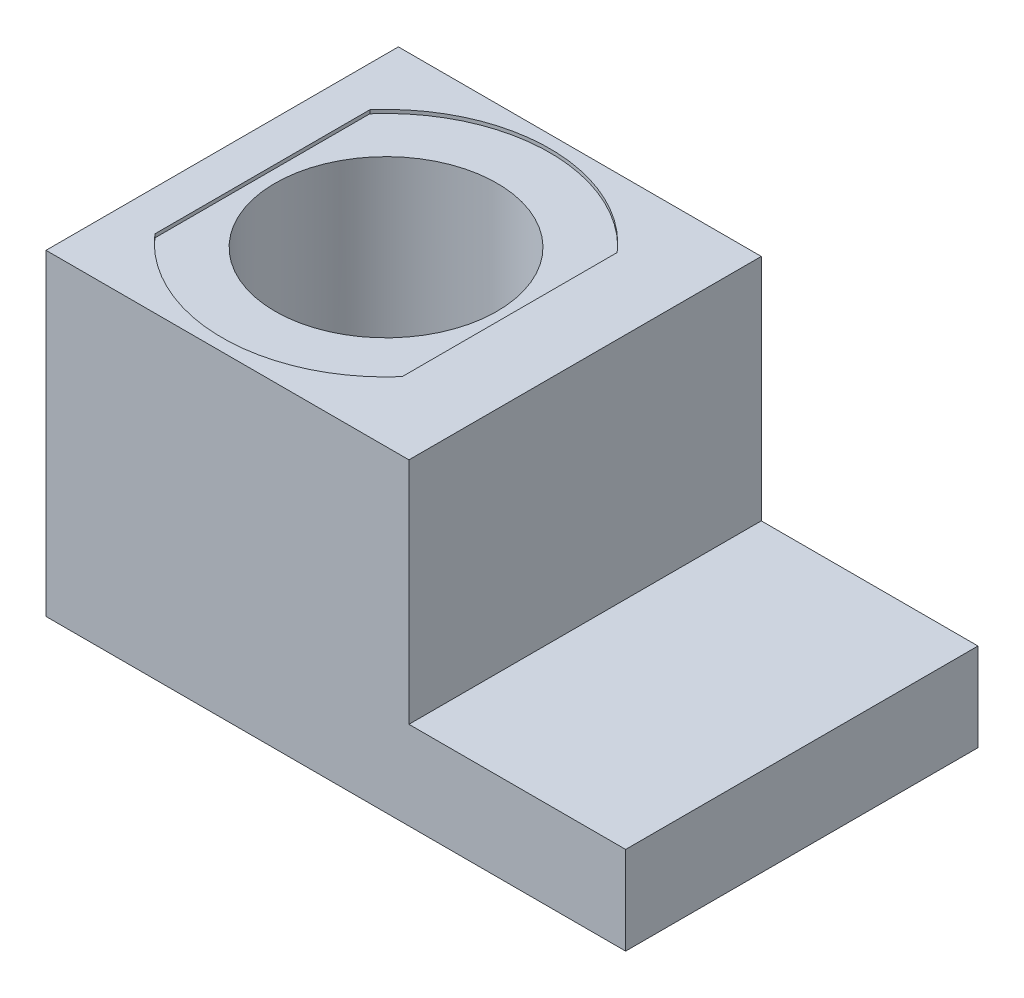
ISO-10303-21;
HEADER;
FILE_DESCRIPTION(('STEP AP214'),'2;1');
FILE_NAME('part.step','',(''),(''),'','','');
FILE_SCHEMA(('AUTOMOTIVE_DESIGN { 1 0 10303 214 1 1 1 1 }'));
ENDSEC;
DATA;
#1=APPLICATION_CONTEXT('core data for automotive mechanical design processes');
#2=APPLICATION_PROTOCOL_DEFINITION('international standard','automotive_design',2000,#1);
#3=PRODUCT_CONTEXT('',#1,'mechanical');
#4=PRODUCT('Part','Part','',(#3));
#5=PRODUCT_RELATED_PRODUCT_CATEGORY('part','',(#4));
#6=PRODUCT_DEFINITION_FORMATION('','',#4);
#7=PRODUCT_DEFINITION_CONTEXT('part definition',#1,'design');
#8=PRODUCT_DEFINITION('design','',#6,#7);
#9=PRODUCT_DEFINITION_SHAPE('','',#8);
#10=(LENGTH_UNIT() NAMED_UNIT(*) SI_UNIT(.MILLI.,.METRE.));
#11=(NAMED_UNIT(*) PLANE_ANGLE_UNIT() SI_UNIT($,.RADIAN.));
#12=(NAMED_UNIT(*) SI_UNIT($,.STERADIAN.) SOLID_ANGLE_UNIT());
#13=UNCERTAINTY_MEASURE_WITH_UNIT(LENGTH_MEASURE(1.E-05),#10,'distance_accuracy_value','');
#14=(GEOMETRIC_REPRESENTATION_CONTEXT(3) GLOBAL_UNCERTAINTY_ASSIGNED_CONTEXT((#13)) GLOBAL_UNIT_ASSIGNED_CONTEXT((#10,
#11,#12)) REPRESENTATION_CONTEXT('',''));
#15=CARTESIAN_POINT('',(0.,0.,0.));
#16=DIRECTION('',(0.,0.,1.));
#17=DIRECTION('',(1.,0.,0.));
#18=AXIS2_PLACEMENT_3D('',#15,#16,#17);
#19=CARTESIAN_POINT('',(0.,90.,0.));
#20=DIRECTION('',(0.,-1.,0.));
#21=DIRECTION('',(0.,0.,-1.));
#22=AXIS2_PLACEMENT_3D('',#19,#20,#21);
#23=PLANE('',#22);
#24=DIRECTION('',(1.,0.,0.));
#25=VECTOR('',#24,1.);
#26=CARTESIAN_POINT('',(103.,90.,0.));
#27=LINE('',#26,#25);
#28=CARTESIAN_POINT('',(0.,90.,0.));
#29=VERTEX_POINT('',#28);
#30=CARTESIAN_POINT('',(103.,90.,0.));
#31=VERTEX_POINT('',#30);
#32=EDGE_CURVE('E182',#29,#31,#27,.T.);
#33=ORIENTED_EDGE('',*,*,#32,.T.);
#34=DIRECTION('',(0.,0.,-1.));
#35=VECTOR('',#34,1.);
#36=CARTESIAN_POINT('',(103.,90.,-100.));
#37=LINE('',#36,#35);
#38=CARTESIAN_POINT('',(103.,90.,-100.));
#39=VERTEX_POINT('',#38);
#40=EDGE_CURVE('E186',#31,#39,#37,.T.);
#41=ORIENTED_EDGE('',*,*,#40,.T.);
#42=DIRECTION('',(-1.,0.,0.));
#43=VECTOR('',#42,1.);
#44=CARTESIAN_POINT('',(0.,90.,-100.));
#45=LINE('',#44,#43);
#46=CARTESIAN_POINT('',(0.,90.,-100.));
#47=VERTEX_POINT('',#46);
#48=EDGE_CURVE('E189',#39,#47,#45,.T.);
#49=ORIENTED_EDGE('',*,*,#48,.T.);
#50=DIRECTION('',(0.,0.,1.));
#51=VECTOR('',#50,1.);
#52=CARTESIAN_POINT('',(0.,90.,0.));
#53=LINE('',#52,#51);
#54=EDGE_CURVE('E193',#47,#29,#53,.T.);
#55=ORIENTED_EDGE('',*,*,#54,.T.);
#56=EDGE_LOOP('',(#33,#41,#49,#55));
#57=FACE_BOUND('',#56,.T.);
#58=DIRECTION('',(0.,0.,1.));
#59=VECTOR('',#58,1.);
#60=CARTESIAN_POINT('',(81.5939954803591,90.,0.));
#61=LINE('',#60,#59);
#62=CARTESIAN_POINT('',(81.5939954803591,90.,-80.5067448480584));
#63=VERTEX_POINT('',#62);
#64=CARTESIAN_POINT('',(81.5939954803591,90.,-19.4932551519416));
#65=VERTEX_POINT('',#64);
#66=EDGE_CURVE('E61',#63,#65,#61,.T.);
#67=ORIENTED_EDGE('',*,*,#66,.T.);
#68=CARTESIAN_POINT('',(46.5,90.,-50.));
#69=DIRECTION('',(0.,1.,0.));
#70=DIRECTION('',(0.,0.,1.));
#71=AXIS2_PLACEMENT_3D('',#68,#69,#70);
#72=CIRCLE('',#71,46.5);
#73=CARTESIAN_POINT('',(11.406004519641,90.,-19.4932551519416));
#74=VERTEX_POINT('',#73);
#75=EDGE_CURVE('E143',#74,#65,#72,.T.);
#76=ORIENTED_EDGE('',*,*,#75,.F.);
#77=DIRECTION('',(0.,0.,-1.));
#78=VECTOR('',#77,1.);
#79=CARTESIAN_POINT('',(11.406004519641,90.,0.));
#80=LINE('',#79,#78);
#81=CARTESIAN_POINT('',(11.406004519641,90.,-80.5067448480584));
#82=VERTEX_POINT('',#81);
#83=EDGE_CURVE('E163',#74,#82,#80,.T.);
#84=ORIENTED_EDGE('',*,*,#83,.T.);
#85=CARTESIAN_POINT('',(46.5,90.,-50.));
#86=DIRECTION('',(0.,1.,0.));
#87=DIRECTION('',(0.,0.,1.));
#88=AXIS2_PLACEMENT_3D('',#85,#86,#87);
#89=CIRCLE('',#88,46.5);
#90=EDGE_CURVE('E160',#63,#82,#89,.T.);
#91=ORIENTED_EDGE('',*,*,#90,.F.);
#92=EDGE_LOOP('',(#67,#76,#84,#91));
#93=FACE_BOUND('',#92,.T.);
#94=ADVANCED_FACE('F45',(#57,#93),#23,.F.);
#95=CARTESIAN_POINT('',(46.5,-35.0000000000001,-50.));
#96=DIRECTION('',(0.,1.,0.));
#97=DIRECTION('',(0.,0.,1.));
#98=AXIS2_PLACEMENT_3D('',#95,#96,#97);
#99=CYLINDRICAL_SURFACE('',#98,31.5);
#100=CARTESIAN_POINT('',(46.5,0.,-50.));
#101=DIRECTION('',(0.,-1.,0.));
#102=DIRECTION('',(0.,0.,-1.));
#103=AXIS2_PLACEMENT_3D('',#100,#101,#102);
#104=CIRCLE('',#103,31.5);
#105=CARTESIAN_POINT('',(46.5,0.,-81.5));
#106=VERTEX_POINT('',#105);
#107=EDGE_CURVE('E173',#106,#106,#104,.T.);
#108=ORIENTED_EDGE('',*,*,#107,.T.);
#109=EDGE_LOOP('',(#108));
#110=FACE_BOUND('',#109,.T.);
#111=CARTESIAN_POINT('',(46.5,89.,-50.));
#112=DIRECTION('',(0.,1.,0.));
#113=DIRECTION('',(0.,0.,1.));
#114=AXIS2_PLACEMENT_3D('',#111,#112,#113);
#115=CIRCLE('',#114,31.5);
#116=CARTESIAN_POINT('',(46.5,89.,-18.5));
#117=VERTEX_POINT('',#116);
#118=EDGE_CURVE('E131',#117,#117,#115,.F.);
#119=ORIENTED_EDGE('',*,*,#118,.F.);
#120=EDGE_LOOP('',(#119));
#121=FACE_BOUND('',#120,.T.);
#122=ADVANCED_FACE('F265',(#110,#121),#99,.F.);
#123=CARTESIAN_POINT('',(0.,25.,0.));
#124=DIRECTION('',(0.,-1.,0.));
#125=DIRECTION('',(0.,0.,-1.));
#126=AXIS2_PLACEMENT_3D('',#123,#124,#125);
#127=PLANE('',#126);
#128=DIRECTION('',(0.,0.,-1.));
#129=VECTOR('',#128,1.);
#130=CARTESIAN_POINT('',(103.,25.,-100.));
#131=LINE('',#130,#129);
#132=CARTESIAN_POINT('',(103.,25.,0.));
#133=VERTEX_POINT('',#132);
#134=CARTESIAN_POINT('',(103.,25.,-100.));
#135=VERTEX_POINT('',#134);
#136=EDGE_CURVE('E69',#133,#135,#131,.T.);
#137=ORIENTED_EDGE('',*,*,#136,.F.);
#138=DIRECTION('',(1.,0.,0.));
#139=VECTOR('',#138,1.);
#140=CARTESIAN_POINT('',(0.,25.,0.));
#141=LINE('',#140,#139);
#142=CARTESIAN_POINT('',(164.5,25.,0.));
#143=VERTEX_POINT('',#142);
#144=EDGE_CURVE('E208',#133,#143,#141,.T.);
#145=ORIENTED_EDGE('',*,*,#144,.T.);
#146=DIRECTION('',(0.,0.,-1.));
#147=VECTOR('',#146,1.);
#148=CARTESIAN_POINT('',(164.5,25.,0.));
#149=LINE('',#148,#147);
#150=CARTESIAN_POINT('',(164.5,25.,-100.));
#151=VERTEX_POINT('',#150);
#152=EDGE_CURVE('E211',#143,#151,#149,.T.);
#153=ORIENTED_EDGE('',*,*,#152,.T.);
#154=DIRECTION('',(-1.,0.,0.));
#155=VECTOR('',#154,1.);
#156=CARTESIAN_POINT('',(0.,25.,-100.));
#157=LINE('',#156,#155);
#158=EDGE_CURVE('E215',#151,#135,#157,.T.);
#159=ORIENTED_EDGE('',*,*,#158,.T.);
#160=EDGE_LOOP('',(#137,#145,#153,#159));
#161=FACE_BOUND('',#160,.T.);
#162=ADVANCED_FACE('F263',(#161),#127,.F.);
#163=CARTESIAN_POINT('',(0.,25.,0.));
#164=DIRECTION('',(1.,0.,0.));
#165=DIRECTION('',(0.,0.,-1.));
#166=AXIS2_PLACEMENT_3D('',#163,#164,#165);
#167=PLANE('',#166);
#168=DIRECTION('',(0.,0.,1.));
#169=VECTOR('',#168,1.);
#170=CARTESIAN_POINT('',(0.,0.,0.));
#171=LINE('',#170,#169);
#172=CARTESIAN_POINT('',(0.,0.,-100.));
#173=VERTEX_POINT('',#172);
#174=CARTESIAN_POINT('',(0.,0.,0.));
#175=VERTEX_POINT('',#174);
#176=EDGE_CURVE('E207',#173,#175,#171,.T.);
#177=ORIENTED_EDGE('',*,*,#176,.T.);
#178=DIRECTION('',(0.,-1.,0.));
#179=VECTOR('',#178,1.);
#180=CARTESIAN_POINT('',(0.,25.,0.));
#181=LINE('',#180,#179);
#182=EDGE_CURVE('E11',#29,#175,#181,.T.);
#183=ORIENTED_EDGE('',*,*,#182,.F.);
#184=ORIENTED_EDGE('',*,*,#54,.F.);
#185=DIRECTION('',(0.,-1.,0.));
#186=VECTOR('',#185,1.);
#187=CARTESIAN_POINT('',(0.,25.,-100.));
#188=LINE('',#187,#186);
#189=EDGE_CURVE('E218',#47,#173,#188,.T.);
#190=ORIENTED_EDGE('',*,*,#189,.T.);
#191=EDGE_LOOP('',(#177,#183,#184,#190));
#192=FACE_BOUND('',#191,.T.);
#193=ADVANCED_FACE('F47',(#192),#167,.F.);
#194=CARTESIAN_POINT('',(0.,25.,0.));
#195=DIRECTION('',(0.,0.,-1.));
#196=DIRECTION('',(-1.,0.,0.));
#197=AXIS2_PLACEMENT_3D('',#194,#195,#196);
#198=PLANE('',#197);
#199=DIRECTION('',(1.,0.,0.));
#200=VECTOR('',#199,1.);
#201=CARTESIAN_POINT('',(0.,0.,0.));
#202=LINE('',#201,#200);
#203=CARTESIAN_POINT('',(164.5,0.,0.));
#204=VERTEX_POINT('',#203);
#205=EDGE_CURVE('E222',#175,#204,#202,.T.);
#206=ORIENTED_EDGE('',*,*,#205,.T.);
#207=DIRECTION('',(0.,-1.,0.));
#208=VECTOR('',#207,1.);
#209=CARTESIAN_POINT('',(164.5,25.,0.));
#210=LINE('',#209,#208);
#211=EDGE_CURVE('E54',#143,#204,#210,.T.);
#212=ORIENTED_EDGE('',*,*,#211,.F.);
#213=ORIENTED_EDGE('',*,*,#144,.F.);
#214=DIRECTION('',(0.,-1.,0.));
#215=VECTOR('',#214,1.);
#216=CARTESIAN_POINT('',(103.,90.,0.));
#217=LINE('',#216,#215);
#218=EDGE_CURVE('E203',#31,#133,#217,.T.);
#219=ORIENTED_EDGE('',*,*,#218,.F.);
#220=ORIENTED_EDGE('',*,*,#32,.F.);
#221=ORIENTED_EDGE('',*,*,#182,.T.);
#222=EDGE_LOOP('',(#206,#212,#213,#219,#220,#221));
#223=FACE_BOUND('',#222,.T.);
#224=ADVANCED_FACE('F259',(#223),#198,.F.);
#225=CARTESIAN_POINT('',(164.5,25.,0.));
#226=DIRECTION('',(-1.,0.,0.));
#227=DIRECTION('',(0.,0.,1.));
#228=AXIS2_PLACEMENT_3D('',#225,#226,#227);
#229=PLANE('',#228);
#230=DIRECTION('',(0.,0.,-1.));
#231=VECTOR('',#230,1.);
#232=CARTESIAN_POINT('',(164.5,0.,0.));
#233=LINE('',#232,#231);
#234=CARTESIAN_POINT('',(164.5,0.,-100.));
#235=VERTEX_POINT('',#234);
#236=EDGE_CURVE('E225',#204,#235,#233,.T.);
#237=ORIENTED_EDGE('',*,*,#236,.T.);
#238=DIRECTION('',(0.,-1.,0.));
#239=VECTOR('',#238,1.);
#240=CARTESIAN_POINT('',(164.5,25.,-100.));
#241=LINE('',#240,#239);
#242=EDGE_CURVE('E233',#151,#235,#241,.T.);
#243=ORIENTED_EDGE('',*,*,#242,.F.);
#244=ORIENTED_EDGE('',*,*,#152,.F.);
#245=ORIENTED_EDGE('',*,*,#211,.T.);
#246=EDGE_LOOP('',(#237,#243,#244,#245));
#247=FACE_BOUND('',#246,.T.);
#248=ADVANCED_FACE('F242',(#247),#229,.F.);
#249=CARTESIAN_POINT('',(0.,25.,-100.));
#250=DIRECTION('',(0.,0.,1.));
#251=DIRECTION('',(1.,0.,0.));
#252=AXIS2_PLACEMENT_3D('',#249,#250,#251);
#253=PLANE('',#252);
#254=DIRECTION('',(-1.,0.,0.));
#255=VECTOR('',#254,1.);
#256=CARTESIAN_POINT('',(0.,0.,-100.));
#257=LINE('',#256,#255);
#258=EDGE_CURVE('E212',#235,#173,#257,.T.);
#259=ORIENTED_EDGE('',*,*,#258,.T.);
#260=ORIENTED_EDGE('',*,*,#189,.F.);
#261=ORIENTED_EDGE('',*,*,#48,.F.);
#262=DIRECTION('',(0.,-1.,0.));
#263=VECTOR('',#262,1.);
#264=CARTESIAN_POINT('',(103.,90.,-100.));
#265=LINE('',#264,#263);
#266=EDGE_CURVE('E197',#39,#135,#265,.T.);
#267=ORIENTED_EDGE('',*,*,#266,.T.);
#268=ORIENTED_EDGE('',*,*,#158,.F.);
#269=ORIENTED_EDGE('',*,*,#242,.T.);
#270=EDGE_LOOP('',(#259,#260,#261,#267,#268,#269));
#271=FACE_BOUND('',#270,.T.);
#272=ADVANCED_FACE('F250',(#271),#253,.F.);
#273=CARTESIAN_POINT('',(0.,0.,0.));
#274=DIRECTION('',(0.,-1.,0.));
#275=DIRECTION('',(0.,0.,-1.));
#276=AXIS2_PLACEMENT_3D('',#273,#274,#275);
#277=PLANE('',#276);
#278=ORIENTED_EDGE('',*,*,#107,.F.);
#279=EDGE_LOOP('',(#278));
#280=FACE_BOUND('',#279,.T.);
#281=ORIENTED_EDGE('',*,*,#176,.F.);
#282=ORIENTED_EDGE('',*,*,#258,.F.);
#283=ORIENTED_EDGE('',*,*,#236,.F.);
#284=ORIENTED_EDGE('',*,*,#205,.F.);
#285=EDGE_LOOP('',(#281,#282,#283,#284));
#286=FACE_BOUND('',#285,.T.);
#287=ADVANCED_FACE('F248',(#280,#286),#277,.T.);
#288=CARTESIAN_POINT('',(103.,90.,-100.));
#289=DIRECTION('',(-1.,0.,0.));
#290=DIRECTION('',(0.,0.,1.));
#291=AXIS2_PLACEMENT_3D('',#288,#289,#290);
#292=PLANE('',#291);
#293=ORIENTED_EDGE('',*,*,#136,.T.);
#294=ORIENTED_EDGE('',*,*,#266,.F.);
#295=ORIENTED_EDGE('',*,*,#40,.F.);
#296=ORIENTED_EDGE('',*,*,#218,.T.);
#297=EDGE_LOOP('',(#293,#294,#295,#296));
#298=FACE_BOUND('',#297,.T.);
#299=ADVANCED_FACE('F261',(#298),#292,.F.);
#300=CARTESIAN_POINT('',(81.5939954803591,89.,0.));
#301=DIRECTION('',(-1.,0.,0.));
#302=DIRECTION('',(0.,0.,1.));
#303=AXIS2_PLACEMENT_3D('',#300,#301,#302);
#304=PLANE('',#303);
#305=ORIENTED_EDGE('',*,*,#66,.F.);
#306=DIRECTION('',(0.,1.,0.));
#307=VECTOR('',#306,1.);
#308=CARTESIAN_POINT('',(81.5939954803591,89.,-80.5067448480584));
#309=LINE('',#308,#307);
#310=CARTESIAN_POINT('',(81.5939954803591,89.,-80.5067448480584));
#311=VERTEX_POINT('',#310);
#312=EDGE_CURVE('E120',#311,#63,#309,.T.);
#313=ORIENTED_EDGE('',*,*,#312,.F.);
#314=DIRECTION('',(0.,0.,1.));
#315=VECTOR('',#314,1.);
#316=CARTESIAN_POINT('',(81.5939954803591,89.,0.));
#317=LINE('',#316,#315);
#318=CARTESIAN_POINT('',(81.5939954803591,89.,-19.4932551519416));
#319=VERTEX_POINT('',#318);
#320=EDGE_CURVE('E123',#311,#319,#317,.T.);
#321=ORIENTED_EDGE('',*,*,#320,.T.);
#322=DIRECTION('',(0.,1.,0.));
#323=VECTOR('',#322,1.);
#324=CARTESIAN_POINT('',(81.5939954803591,89.,-19.4932551519416));
#325=LINE('',#324,#323);
#326=EDGE_CURVE('E170',#319,#65,#325,.T.);
#327=ORIENTED_EDGE('',*,*,#326,.T.);
#328=EDGE_LOOP('',(#305,#313,#321,#327));
#329=FACE_BOUND('',#328,.T.);
#330=ADVANCED_FACE('F122',(#329),#304,.T.);
#331=CARTESIAN_POINT('',(46.5,89.,-50.));
#332=DIRECTION('',(0.,1.,0.));
#333=DIRECTION('',(0.,0.,1.));
#334=AXIS2_PLACEMENT_3D('',#331,#332,#333);
#335=CYLINDRICAL_SURFACE('',#334,46.5);
#336=ORIENTED_EDGE('',*,*,#75,.T.);
#337=ORIENTED_EDGE('',*,*,#326,.F.);
#338=CARTESIAN_POINT('',(46.5,89.,-50.));
#339=DIRECTION('',(0.,1.,0.));
#340=DIRECTION('',(0.,0.,1.));
#341=AXIS2_PLACEMENT_3D('',#338,#339,#340);
#342=CIRCLE('',#341,46.5);
#343=CARTESIAN_POINT('',(11.406004519641,89.,-19.4932551519416));
#344=VERTEX_POINT('',#343);
#345=EDGE_CURVE('E141',#344,#319,#342,.T.);
#346=ORIENTED_EDGE('',*,*,#345,.F.);
#347=DIRECTION('',(0.,1.,0.));
#348=VECTOR('',#347,1.);
#349=CARTESIAN_POINT('',(11.406004519641,89.,-19.4932551519416));
#350=LINE('',#349,#348);
#351=EDGE_CURVE('E174',#344,#74,#350,.T.);
#352=ORIENTED_EDGE('',*,*,#351,.T.);
#353=EDGE_LOOP('',(#336,#337,#346,#352));
#354=FACE_BOUND('',#353,.T.);
#355=ADVANCED_FACE('F287',(#354),#335,.F.);
#356=CARTESIAN_POINT('',(11.406004519641,89.,0.));
#357=DIRECTION('',(1.,0.,0.));
#358=DIRECTION('',(0.,0.,-1.));
#359=AXIS2_PLACEMENT_3D('',#356,#357,#358);
#360=PLANE('',#359);
#361=ORIENTED_EDGE('',*,*,#83,.F.);
#362=ORIENTED_EDGE('',*,*,#351,.F.);
#363=DIRECTION('',(0.,0.,-1.));
#364=VECTOR('',#363,1.);
#365=CARTESIAN_POINT('',(11.406004519641,89.,0.));
#366=LINE('',#365,#364);
#367=CARTESIAN_POINT('',(11.406004519641,89.,-80.5067448480584));
#368=VERTEX_POINT('',#367);
#369=EDGE_CURVE('E148',#344,#368,#366,.T.);
#370=ORIENTED_EDGE('',*,*,#369,.T.);
#371=DIRECTION('',(0.,1.,0.));
#372=VECTOR('',#371,1.);
#373=CARTESIAN_POINT('',(11.406004519641,89.,-80.5067448480584));
#374=LINE('',#373,#372);
#375=EDGE_CURVE('E130',#368,#82,#374,.T.);
#376=ORIENTED_EDGE('',*,*,#375,.T.);
#377=EDGE_LOOP('',(#361,#362,#370,#376));
#378=FACE_BOUND('',#377,.T.);
#379=ADVANCED_FACE('F336',(#378),#360,.T.);
#380=CARTESIAN_POINT('',(46.5,89.,-50.));
#381=DIRECTION('',(0.,1.,0.));
#382=DIRECTION('',(0.,0.,1.));
#383=AXIS2_PLACEMENT_3D('',#380,#381,#382);
#384=CYLINDRICAL_SURFACE('',#383,46.5);
#385=ORIENTED_EDGE('',*,*,#90,.T.);
#386=ORIENTED_EDGE('',*,*,#375,.F.);
#387=CARTESIAN_POINT('',(46.5,89.,-50.));
#388=DIRECTION('',(0.,1.,0.));
#389=DIRECTION('',(0.,0.,1.));
#390=AXIS2_PLACEMENT_3D('',#387,#388,#389);
#391=CIRCLE('',#390,46.5);
#392=EDGE_CURVE('E139',#311,#368,#391,.T.);
#393=ORIENTED_EDGE('',*,*,#392,.F.);
#394=ORIENTED_EDGE('',*,*,#312,.T.);
#395=EDGE_LOOP('',(#385,#386,#393,#394));
#396=FACE_BOUND('',#395,.T.);
#397=ADVANCED_FACE('F146',(#396),#384,.F.);
#398=CARTESIAN_POINT('',(0.,89.,0.));
#399=DIRECTION('',(0.,1.,0.));
#400=DIRECTION('',(0.,0.,1.));
#401=AXIS2_PLACEMENT_3D('',#398,#399,#400);
#402=PLANE('',#401);
#403=ORIENTED_EDGE('',*,*,#320,.F.);
#404=ORIENTED_EDGE('',*,*,#392,.T.);
#405=ORIENTED_EDGE('',*,*,#369,.F.);
#406=ORIENTED_EDGE('',*,*,#345,.T.);
#407=EDGE_LOOP('',(#403,#404,#405,#406));
#408=FACE_BOUND('',#407,.T.);
#409=ORIENTED_EDGE('',*,*,#118,.T.);
#410=EDGE_LOOP('',(#409));
#411=FACE_BOUND('',#410,.T.);
#412=ADVANCED_FACE('F136',(#408,#411),#402,.T.);
#413=CLOSED_SHELL('',(#94,#122,#162,#193,#224,#248,#272,#287,#299,#330,#355,#379,#397,#412));
#414=MANIFOLD_SOLID_BREP('B2',#413);
#415=ADVANCED_BREP_SHAPE_REPRESENTATION('',(#18,#414),#14);
#416=SHAPE_DEFINITION_REPRESENTATION(#9,#415);
ENDSEC;
END-ISO-10303-21;
